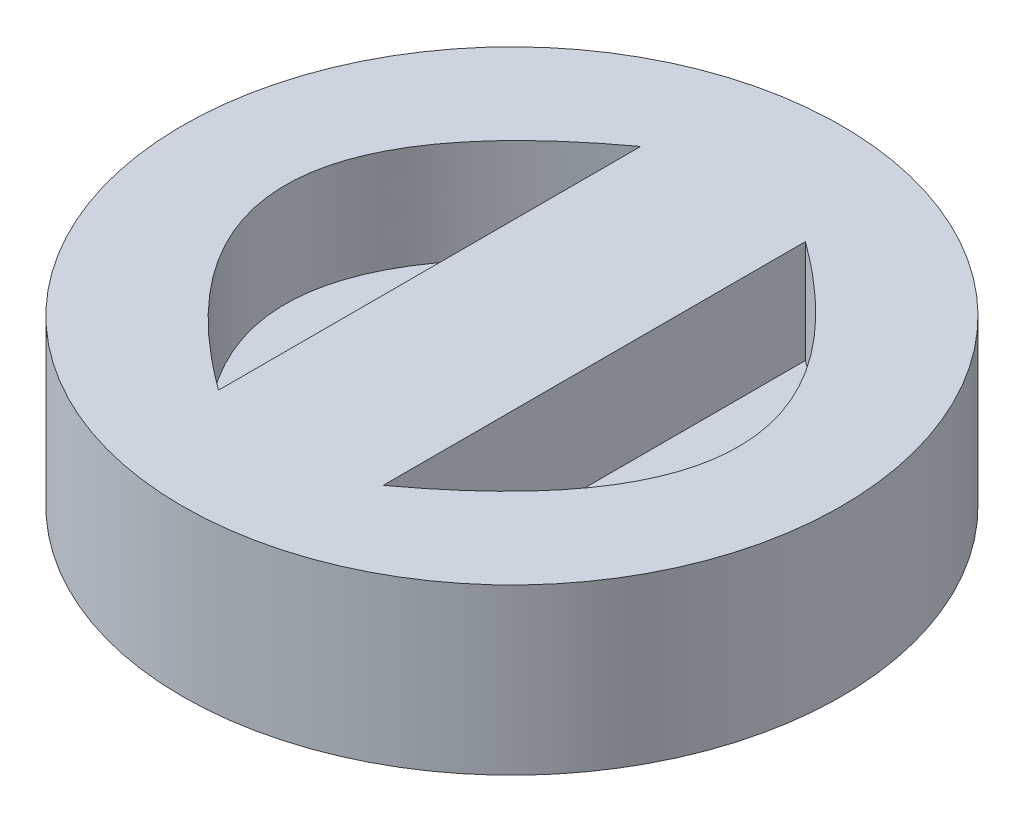
ISO-10303-21;
HEADER;
FILE_DESCRIPTION(('STEP AP214'),'2;1');
FILE_NAME('part.step','',(''),(''),'','','');
FILE_SCHEMA(('AUTOMOTIVE_DESIGN { 1 0 10303 214 1 1 1 1 }'));
ENDSEC;
DATA;
#1=APPLICATION_CONTEXT('core data for automotive mechanical design processes');
#2=APPLICATION_PROTOCOL_DEFINITION('international standard','automotive_design',2000,#1);
#3=PRODUCT_CONTEXT('',#1,'mechanical');
#4=PRODUCT('Part','Part','',(#3));
#5=PRODUCT_RELATED_PRODUCT_CATEGORY('part','',(#4));
#6=PRODUCT_DEFINITION_FORMATION('','',#4);
#7=PRODUCT_DEFINITION_CONTEXT('part definition',#1,'design');
#8=PRODUCT_DEFINITION('design','',#6,#7);
#9=PRODUCT_DEFINITION_SHAPE('','',#8);
#10=(LENGTH_UNIT() NAMED_UNIT(*) SI_UNIT(.MILLI.,.METRE.));
#11=(NAMED_UNIT(*) PLANE_ANGLE_UNIT() SI_UNIT($,.RADIAN.));
#12=(NAMED_UNIT(*) SI_UNIT($,.STERADIAN.) SOLID_ANGLE_UNIT());
#13=UNCERTAINTY_MEASURE_WITH_UNIT(LENGTH_MEASURE(1.E-05),#10,'distance_accuracy_value','');
#14=(GEOMETRIC_REPRESENTATION_CONTEXT(3) GLOBAL_UNCERTAINTY_ASSIGNED_CONTEXT((#13)) GLOBAL_UNIT_ASSIGNED_CONTEXT((#10,
#11,#12)) REPRESENTATION_CONTEXT('',''));
#15=CARTESIAN_POINT('',(0.,0.,0.));
#16=DIRECTION('',(0.,0.,1.));
#17=DIRECTION('',(1.,0.,0.));
#18=AXIS2_PLACEMENT_3D('',#15,#16,#17);
#19=CARTESIAN_POINT('',(-62.4172277039698,8.,-31.4468475455115));
#20=DIRECTION('',(0.,-1.,0.));
#21=DIRECTION('',(0.,0.,-1.));
#22=AXIS2_PLACEMENT_3D('',#19,#20,#21);
#23=CYLINDRICAL_SURFACE('',#22,16.);
#24=CARTESIAN_POINT('',(-62.4172277039698,8.,-31.4468475455115));
#25=DIRECTION('',(0.,1.,0.));
#26=DIRECTION('',(0.,0.,1.));
#27=AXIS2_PLACEMENT_3D('',#24,#25,#26);
#28=CIRCLE('',#27,16.);
#29=CARTESIAN_POINT('',(-62.4172277039698,8.,-15.4468475455115));
#30=VERTEX_POINT('',#29);
#31=EDGE_CURVE('E11',#30,#30,#28,.T.);
#32=ORIENTED_EDGE('',*,*,#31,.F.);
#33=EDGE_LOOP('',(#32));
#34=FACE_BOUND('',#33,.T.);
#35=CARTESIAN_POINT('',(-62.4172277039698,0.,-31.4468475455115));
#36=DIRECTION('',(0.,1.,0.));
#37=DIRECTION('',(0.,0.,1.));
#38=AXIS2_PLACEMENT_3D('',#35,#36,#37);
#39=CIRCLE('',#38,16.);
#40=CARTESIAN_POINT('',(-62.4172277039698,0.,-15.4468475455115));
#41=VERTEX_POINT('',#40);
#42=EDGE_CURVE('E52',#41,#41,#39,.T.);
#43=ORIENTED_EDGE('',*,*,#42,.T.);
#44=EDGE_LOOP('',(#43));
#45=FACE_BOUND('',#44,.T.);
#46=ADVANCED_FACE('F49',(#34,#45),#23,.T.);
#47=CARTESIAN_POINT('',(-62.4172277039698,8.,-31.4468475455115));
#48=DIRECTION('',(0.,1.,0.));
#49=DIRECTION('',(0.,0.,1.));
#50=AXIS2_PLACEMENT_3D('',#47,#48,#49);
#51=PLANE('',#50);
#52=CARTESIAN_POINT('',(-66.4172277039698,8.,-41.6937983114711));
#53=CARTESIAN_POINT('',(-80.4172277039698,8.,-31.4468475455115));
#54=CARTESIAN_POINT('',(-66.4172277039698,8.,-21.1998967795519));
#55=B_SPLINE_CURVE_WITH_KNOTS('',2,(#52,#53,#54),.UNSPECIFIED.,.F.,.F.,(3,3),(0.,1.),.UNSPECIFIED.);
#56=CARTESIAN_POINT('',(-66.4172277039698,8.,-41.6937983114711));
#57=VERTEX_POINT('',#56);
#58=CARTESIAN_POINT('',(-66.4172277039698,8.,-21.1998967795519));
#59=VERTEX_POINT('',#58);
#60=EDGE_CURVE('E64',#57,#59,#55,.T.);
#61=ORIENTED_EDGE('',*,*,#60,.F.);
#62=DIRECTION('',(0.,0.,-1.));
#63=VECTOR('',#62,1.);
#64=CARTESIAN_POINT('',(-66.4172277039698,8.,-41.6937983114711));
#65=LINE('',#64,#63);
#66=EDGE_CURVE('E107',#59,#57,#65,.T.);
#67=ORIENTED_EDGE('',*,*,#66,.F.);
#68=EDGE_LOOP('',(#61,#67));
#69=FACE_BOUND('',#68,.T.);
#70=CARTESIAN_POINT('',(-58.4172277039698,8.,-21.1998967795519));
#71=CARTESIAN_POINT('',(-44.4172277039698,8.,-31.4468475455115));
#72=CARTESIAN_POINT('',(-58.4172277039698,8.,-41.6937983114711));
#73=B_SPLINE_CURVE_WITH_KNOTS('',2,(#70,#71,#72),.UNSPECIFIED.,.F.,.F.,(3,3),(0.,1.),.UNSPECIFIED.);
#74=CARTESIAN_POINT('',(-58.4172277039698,8.,-21.1998967795519));
#75=VERTEX_POINT('',#74);
#76=CARTESIAN_POINT('',(-58.4172277039698,8.,-41.6937983114711));
#77=VERTEX_POINT('',#76);
#78=EDGE_CURVE('E72',#75,#77,#73,.T.);
#79=ORIENTED_EDGE('',*,*,#78,.F.);
#80=DIRECTION('',(0.,0.,1.));
#81=VECTOR('',#80,1.);
#82=CARTESIAN_POINT('',(-58.4172277039698,8.,-41.6937983114711));
#83=LINE('',#82,#81);
#84=EDGE_CURVE('E138',#77,#75,#83,.T.);
#85=ORIENTED_EDGE('',*,*,#84,.F.);
#86=EDGE_LOOP('',(#79,#85));
#87=FACE_BOUND('',#86,.T.);
#88=ORIENTED_EDGE('',*,*,#31,.T.);
#89=EDGE_LOOP('',(#88));
#90=FACE_BOUND('',#89,.T.);
#91=ADVANCED_FACE('F175',(#69,#87,#90),#51,.T.);
#92=CARTESIAN_POINT('',(-62.4172277039698,0.,-31.4468475455115));
#93=DIRECTION('',(0.,1.,0.));
#94=DIRECTION('',(0.,0.,1.));
#95=AXIS2_PLACEMENT_3D('',#92,#93,#94);
#96=PLANE('',#95);
#97=ORIENTED_EDGE('',*,*,#42,.F.);
#98=EDGE_LOOP('',(#97));
#99=FACE_BOUND('',#98,.T.);
#100=ADVANCED_FACE('F129',(#99),#96,.F.);
#101=CARTESIAN_POINT('',(-58.4172277039698,3.,-21.1998967795519));
#102=CARTESIAN_POINT('',(-44.4172277039698,3.,-31.4468475455115));
#103=CARTESIAN_POINT('',(-58.4172277039698,3.,-41.6937983114711));
#104=B_SPLINE_CURVE_WITH_KNOTS('',2,(#101,#102,#103),.UNSPECIFIED.,.F.,.F.,(3,3),(0.,1.),.UNSPECIFIED.);
#105=DIRECTION('',(0.,1.,0.));
#106=VECTOR('',#105,1.);
#107=SURFACE_OF_LINEAR_EXTRUSION('',#104,#106);
#108=ORIENTED_EDGE('',*,*,#78,.T.);
#109=DIRECTION('',(0.,1.,0.));
#110=VECTOR('',#109,1.);
#111=CARTESIAN_POINT('',(-58.4172277039698,3.,-41.6937983114711));
#112=LINE('',#111,#110);
#113=CARTESIAN_POINT('',(-58.4172277039698,3.,-41.6937983114711));
#114=VERTEX_POINT('',#113);
#115=EDGE_CURVE('E146',#114,#77,#112,.T.);
#116=ORIENTED_EDGE('',*,*,#115,.F.);
#117=CARTESIAN_POINT('',(-58.4172277039698,3.,-21.1998967795519));
#118=VERTEX_POINT('',#117);
#119=EDGE_CURVE('E131',#118,#114,#104,.T.);
#120=ORIENTED_EDGE('',*,*,#119,.F.);
#121=DIRECTION('',(0.,1.,0.));
#122=VECTOR('',#121,1.);
#123=CARTESIAN_POINT('',(-58.4172277039698,3.,-21.1998967795519));
#124=LINE('',#123,#122);
#125=EDGE_CURVE('E157',#118,#75,#124,.T.);
#126=ORIENTED_EDGE('',*,*,#125,.T.);
#127=EDGE_LOOP('',(#108,#116,#120,#126));
#128=FACE_BOUND('',#127,.T.);
#129=ADVANCED_FACE('F124',(#128),#107,.F.);
#130=CARTESIAN_POINT('',(-58.4172277039698,3.,-41.6937983114711));
#131=DIRECTION('',(-1.,0.,0.));
#132=DIRECTION('',(0.,0.,1.));
#133=AXIS2_PLACEMENT_3D('',#130,#131,#132);
#134=PLANE('',#133);
#135=ORIENTED_EDGE('',*,*,#84,.T.);
#136=ORIENTED_EDGE('',*,*,#125,.F.);
#137=DIRECTION('',(0.,0.,1.));
#138=VECTOR('',#137,1.);
#139=CARTESIAN_POINT('',(-58.4172277039698,3.,-41.6937983114711));
#140=LINE('',#139,#138);
#141=EDGE_CURVE('E139',#114,#118,#140,.T.);
#142=ORIENTED_EDGE('',*,*,#141,.F.);
#143=ORIENTED_EDGE('',*,*,#115,.T.);
#144=EDGE_LOOP('',(#135,#136,#142,#143));
#145=FACE_BOUND('',#144,.T.);
#146=ADVANCED_FACE('F128',(#145),#134,.F.);
#147=CARTESIAN_POINT('',(-51.4172277039698,3.,-31.4468475455115));
#148=DIRECTION('',(0.,1.,0.));
#149=DIRECTION('',(0.,0.,1.));
#150=AXIS2_PLACEMENT_3D('',#147,#148,#149);
#151=PLANE('',#150);
#152=ORIENTED_EDGE('',*,*,#119,.T.);
#153=ORIENTED_EDGE('',*,*,#141,.T.);
#154=EDGE_LOOP('',(#152,#153));
#155=FACE_BOUND('',#154,.T.);
#156=ADVANCED_FACE('F122',(#155),#151,.T.);
#157=CARTESIAN_POINT('',(-66.4172277039698,3.,-41.6937983114711));
#158=CARTESIAN_POINT('',(-80.4172277039698,3.,-31.4468475455115));
#159=CARTESIAN_POINT('',(-66.4172277039698,3.,-21.1998967795519));
#160=B_SPLINE_CURVE_WITH_KNOTS('',2,(#157,#158,#159),.UNSPECIFIED.,.F.,.F.,(3,3),(0.,1.),.UNSPECIFIED.);
#161=DIRECTION('',(0.,1.,0.));
#162=VECTOR('',#161,1.);
#163=SURFACE_OF_LINEAR_EXTRUSION('',#160,#162);
#164=ORIENTED_EDGE('',*,*,#60,.T.);
#165=DIRECTION('',(0.,1.,0.));
#166=VECTOR('',#165,1.);
#167=CARTESIAN_POINT('',(-66.4172277039698,3.,-21.1998967795519));
#168=LINE('',#167,#166);
#169=CARTESIAN_POINT('',(-66.4172277039698,3.,-21.1998967795519));
#170=VERTEX_POINT('',#169);
#171=EDGE_CURVE('E88',#170,#59,#168,.T.);
#172=ORIENTED_EDGE('',*,*,#171,.F.);
#173=CARTESIAN_POINT('',(-66.4172277039698,3.,-41.6937983114711));
#174=VERTEX_POINT('',#173);
#175=EDGE_CURVE('E92',#174,#170,#160,.T.);
#176=ORIENTED_EDGE('',*,*,#175,.F.);
#177=DIRECTION('',(0.,1.,0.));
#178=VECTOR('',#177,1.);
#179=CARTESIAN_POINT('',(-66.4172277039698,3.,-41.6937983114711));
#180=LINE('',#179,#178);
#181=EDGE_CURVE('E97',#174,#57,#180,.T.);
#182=ORIENTED_EDGE('',*,*,#181,.T.);
#183=EDGE_LOOP('',(#164,#172,#176,#182));
#184=FACE_BOUND('',#183,.T.);
#185=ADVANCED_FACE('F90',(#184),#163,.F.);
#186=CARTESIAN_POINT('',(-66.4172277039698,3.,-41.6937983114711));
#187=DIRECTION('',(1.,0.,0.));
#188=DIRECTION('',(0.,0.,-1.));
#189=AXIS2_PLACEMENT_3D('',#186,#187,#188);
#190=PLANE('',#189);
#191=ORIENTED_EDGE('',*,*,#66,.T.);
#192=ORIENTED_EDGE('',*,*,#181,.F.);
#193=DIRECTION('',(0.,0.,-1.));
#194=VECTOR('',#193,1.);
#195=CARTESIAN_POINT('',(-66.4172277039698,3.,-31.4468475455115));
#196=LINE('',#195,#194);
#197=EDGE_CURVE('E98',#170,#174,#196,.T.);
#198=ORIENTED_EDGE('',*,*,#197,.F.);
#199=ORIENTED_EDGE('',*,*,#171,.T.);
#200=EDGE_LOOP('',(#191,#192,#198,#199));
#201=FACE_BOUND('',#200,.T.);
#202=ADVANCED_FACE('F101',(#201),#190,.F.);
#203=CARTESIAN_POINT('',(-73.4172277039698,3.,-31.4468475455115));
#204=DIRECTION('',(0.,-1.,0.));
#205=DIRECTION('',(0.,0.,-1.));
#206=AXIS2_PLACEMENT_3D('',#203,#204,#205);
#207=PLANE('',#206);
#208=ORIENTED_EDGE('',*,*,#175,.T.);
#209=ORIENTED_EDGE('',*,*,#197,.T.);
#210=EDGE_LOOP('',(#208,#209));
#211=FACE_BOUND('',#210,.T.);
#212=ADVANCED_FACE('F105',(#211),#207,.F.);
#213=CLOSED_SHELL('',(#46,#91,#100,#129,#146,#156,#185,#202,#212));
#214=MANIFOLD_SOLID_BREP('B2',#213);
#215=ADVANCED_BREP_SHAPE_REPRESENTATION('',(#18,#214),#14);
#216=SHAPE_DEFINITION_REPRESENTATION(#9,#215);
ENDSEC;
END-ISO-10303-21;
